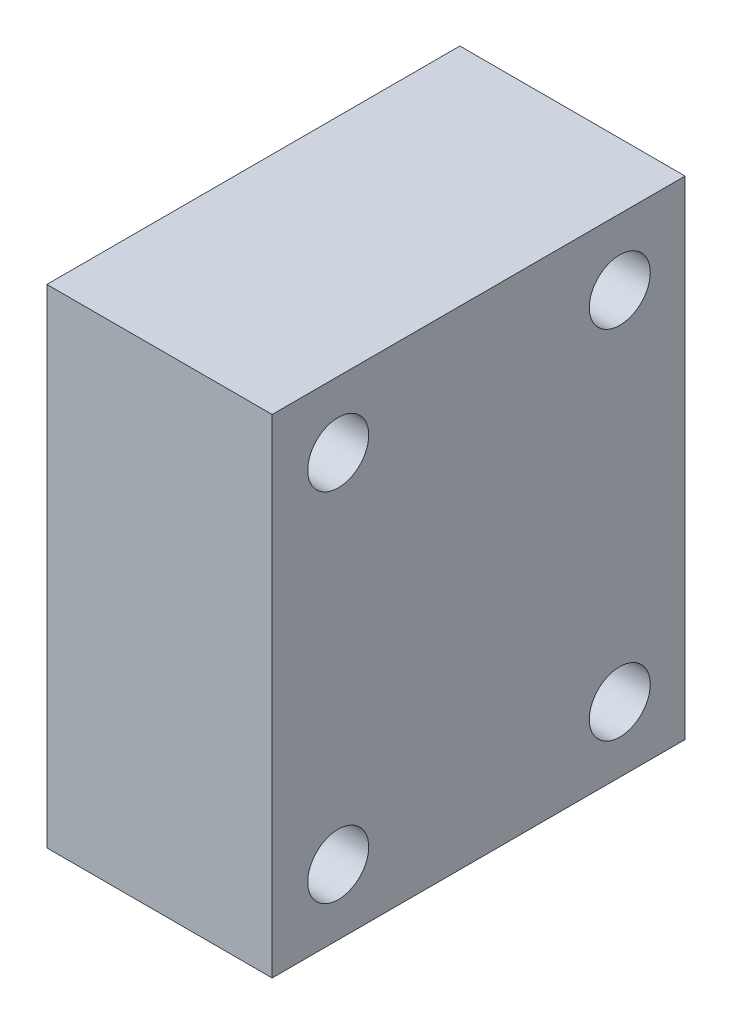
ISO-10303-21;
HEADER;
FILE_DESCRIPTION(('STEP AP214'),'2;1');
FILE_NAME('part.step','',(''),(''),'','','');
FILE_SCHEMA(('AUTOMOTIVE_DESIGN { 1 0 10303 214 1 1 1 1 }'));
ENDSEC;
DATA;
#1=APPLICATION_CONTEXT('core data for automotive mechanical design processes');
#2=APPLICATION_PROTOCOL_DEFINITION('international standard','automotive_design',2000,#1);
#3=PRODUCT_CONTEXT('',#1,'mechanical');
#4=PRODUCT('Part','Part','',(#3));
#5=PRODUCT_RELATED_PRODUCT_CATEGORY('part','',(#4));
#6=PRODUCT_DEFINITION_FORMATION('','',#4);
#7=PRODUCT_DEFINITION_CONTEXT('part definition',#1,'design');
#8=PRODUCT_DEFINITION('design','',#6,#7);
#9=PRODUCT_DEFINITION_SHAPE('','',#8);
#10=(LENGTH_UNIT() NAMED_UNIT(*) SI_UNIT(.MILLI.,.METRE.));
#11=(NAMED_UNIT(*) PLANE_ANGLE_UNIT() SI_UNIT($,.RADIAN.));
#12=(NAMED_UNIT(*) SI_UNIT($,.STERADIAN.) SOLID_ANGLE_UNIT());
#13=UNCERTAINTY_MEASURE_WITH_UNIT(LENGTH_MEASURE(1.E-05),#10,'distance_accuracy_value','');
#14=(GEOMETRIC_REPRESENTATION_CONTEXT(3) GLOBAL_UNCERTAINTY_ASSIGNED_CONTEXT((#13)) GLOBAL_UNIT_ASSIGNED_CONTEXT((#10,
#11,#12)) REPRESENTATION_CONTEXT('',''));
#15=CARTESIAN_POINT('',(0.,0.,0.));
#16=DIRECTION('',(0.,0.,1.));
#17=DIRECTION('',(1.,0.,0.));
#18=AXIS2_PLACEMENT_3D('',#15,#16,#17);
#19=CARTESIAN_POINT('',(38.1,0.,0.));
#20=DIRECTION('',(0.,1.,0.));
#21=DIRECTION('',(0.,0.,1.));
#22=AXIS2_PLACEMENT_3D('',#19,#20,#21);
#23=PLANE('',#22);
#24=DIRECTION('',(0.,0.,-1.));
#25=VECTOR('',#24,1.);
#26=CARTESIAN_POINT('',(0.,0.,0.));
#27=LINE('',#26,#25);
#28=CARTESIAN_POINT('',(0.,0.,69.85));
#29=VERTEX_POINT('',#28);
#30=CARTESIAN_POINT('',(0.,0.,0.));
#31=VERTEX_POINT('',#30);
#32=EDGE_CURVE('E105',#29,#31,#27,.T.);
#33=ORIENTED_EDGE('',*,*,#32,.T.);
#34=DIRECTION('',(-1.,0.,0.));
#35=VECTOR('',#34,1.);
#36=CARTESIAN_POINT('',(38.1,0.,0.));
#37=LINE('',#36,#35);
#38=CARTESIAN_POINT('',(38.1,0.,0.));
#39=VERTEX_POINT('',#38);
#40=EDGE_CURVE('E11',#39,#31,#37,.T.);
#41=ORIENTED_EDGE('',*,*,#40,.F.);
#42=DIRECTION('',(0.,0.,-1.));
#43=VECTOR('',#42,1.);
#44=CARTESIAN_POINT('',(38.1,0.,0.));
#45=LINE('',#44,#43);
#46=CARTESIAN_POINT('',(38.1,0.,69.85));
#47=VERTEX_POINT('',#46);
#48=EDGE_CURVE('E92',#47,#39,#45,.T.);
#49=ORIENTED_EDGE('',*,*,#48,.F.);
#50=DIRECTION('',(-1.,0.,0.));
#51=VECTOR('',#50,1.);
#52=CARTESIAN_POINT('',(38.1,0.,69.85));
#53=LINE('',#52,#51);
#54=EDGE_CURVE('E101',#47,#29,#53,.T.);
#55=ORIENTED_EDGE('',*,*,#54,.T.);
#56=EDGE_LOOP('',(#33,#41,#49,#55));
#57=FACE_BOUND('',#56,.T.);
#58=ADVANCED_FACE('F39',(#57),#23,.F.);
#59=CARTESIAN_POINT('',(38.1,0.,0.));
#60=DIRECTION('',(0.,0.,1.));
#61=DIRECTION('',(1.,0.,0.));
#62=AXIS2_PLACEMENT_3D('',#59,#60,#61);
#63=PLANE('',#62);
#64=DIRECTION('',(0.,1.,0.));
#65=VECTOR('',#64,1.);
#66=CARTESIAN_POINT('',(0.,0.,0.));
#67=LINE('',#66,#65);
#68=CARTESIAN_POINT('',(0.,82.55,0.));
#69=VERTEX_POINT('',#68);
#70=EDGE_CURVE('E96',#31,#69,#67,.T.);
#71=ORIENTED_EDGE('',*,*,#70,.T.);
#72=DIRECTION('',(-1.,0.,0.));
#73=VECTOR('',#72,1.);
#74=CARTESIAN_POINT('',(38.1,82.55,0.));
#75=LINE('',#74,#73);
#76=CARTESIAN_POINT('',(38.1,82.55,0.));
#77=VERTEX_POINT('',#76);
#78=EDGE_CURVE('E48',#77,#69,#75,.T.);
#79=ORIENTED_EDGE('',*,*,#78,.F.);
#80=DIRECTION('',(0.,1.,0.));
#81=VECTOR('',#80,1.);
#82=CARTESIAN_POINT('',(38.1,0.,0.));
#83=LINE('',#82,#81);
#84=EDGE_CURVE('E87',#39,#77,#83,.T.);
#85=ORIENTED_EDGE('',*,*,#84,.F.);
#86=ORIENTED_EDGE('',*,*,#40,.T.);
#87=EDGE_LOOP('',(#71,#79,#85,#86));
#88=FACE_BOUND('',#87,.T.);
#89=ADVANCED_FACE('F95',(#88),#63,.F.);
#90=CARTESIAN_POINT('',(38.1,82.55,0.));
#91=DIRECTION('',(0.,-1.,0.));
#92=DIRECTION('',(0.,0.,-1.));
#93=AXIS2_PLACEMENT_3D('',#90,#91,#92);
#94=PLANE('',#93);
#95=DIRECTION('',(0.,0.,1.));
#96=VECTOR('',#95,1.);
#97=CARTESIAN_POINT('',(0.,82.55,0.));
#98=LINE('',#97,#96);
#99=CARTESIAN_POINT('',(0.,82.55,69.85));
#100=VERTEX_POINT('',#99);
#101=EDGE_CURVE('E74',#69,#100,#98,.T.);
#102=ORIENTED_EDGE('',*,*,#101,.T.);
#103=DIRECTION('',(-1.,0.,0.));
#104=VECTOR('',#103,1.);
#105=CARTESIAN_POINT('',(38.1,82.55,69.85));
#106=LINE('',#105,#104);
#107=CARTESIAN_POINT('',(38.1,82.55,69.85));
#108=VERTEX_POINT('',#107);
#109=EDGE_CURVE('E97',#108,#100,#106,.T.);
#110=ORIENTED_EDGE('',*,*,#109,.F.);
#111=DIRECTION('',(0.,0.,1.));
#112=VECTOR('',#111,1.);
#113=CARTESIAN_POINT('',(38.1,82.55,0.));
#114=LINE('',#113,#112);
#115=EDGE_CURVE('E90',#77,#108,#114,.T.);
#116=ORIENTED_EDGE('',*,*,#115,.F.);
#117=ORIENTED_EDGE('',*,*,#78,.T.);
#118=EDGE_LOOP('',(#102,#110,#116,#117));
#119=FACE_BOUND('',#118,.T.);
#120=ADVANCED_FACE('F99',(#119),#94,.F.);
#121=CARTESIAN_POINT('',(38.1,0.,69.85));
#122=DIRECTION('',(0.,0.,-1.));
#123=DIRECTION('',(-1.,0.,0.));
#124=AXIS2_PLACEMENT_3D('',#121,#122,#123);
#125=PLANE('',#124);
#126=DIRECTION('',(0.,-1.,0.));
#127=VECTOR('',#126,1.);
#128=CARTESIAN_POINT('',(0.,0.,69.85));
#129=LINE('',#128,#127);
#130=EDGE_CURVE('E80',#100,#29,#129,.T.);
#131=ORIENTED_EDGE('',*,*,#130,.T.);
#132=ORIENTED_EDGE('',*,*,#54,.F.);
#133=DIRECTION('',(0.,-1.,0.));
#134=VECTOR('',#133,1.);
#135=CARTESIAN_POINT('',(38.1,0.,69.85));
#136=LINE('',#135,#134);
#137=EDGE_CURVE('E57',#108,#47,#136,.T.);
#138=ORIENTED_EDGE('',*,*,#137,.F.);
#139=ORIENTED_EDGE('',*,*,#109,.T.);
#140=EDGE_LOOP('',(#131,#132,#138,#139));
#141=FACE_BOUND('',#140,.T.);
#142=ADVANCED_FACE('F189',(#141),#125,.F.);
#143=CARTESIAN_POINT('',(38.1,0.,0.));
#144=DIRECTION('',(-1.,0.,0.));
#145=DIRECTION('',(0.,0.,1.));
#146=AXIS2_PLACEMENT_3D('',#143,#144,#145);
#147=PLANE('',#146);
#148=CARTESIAN_POINT('',(38.1,71.374,11.049));
#149=DIRECTION('',(1.,0.,0.));
#150=DIRECTION('',(0.,0.,-1.));
#151=AXIS2_PLACEMENT_3D('',#148,#149,#150);
#152=CIRCLE('',#151,5.15937499999999);
#153=CARTESIAN_POINT('',(38.1,71.374,5.88962500000001));
#154=VERTEX_POINT('',#153);
#155=EDGE_CURVE('E150',#154,#154,#152,.T.);
#156=ORIENTED_EDGE('',*,*,#155,.F.);
#157=EDGE_LOOP('',(#156));
#158=FACE_BOUND('',#157,.T.);
#159=CARTESIAN_POINT('',(38.1,11.049,58.674));
#160=DIRECTION('',(1.,0.,0.));
#161=DIRECTION('',(0.,0.,-1.));
#162=AXIS2_PLACEMENT_3D('',#159,#160,#161);
#163=CIRCLE('',#162,5.159375);
#164=CARTESIAN_POINT('',(38.1,11.049,53.514625));
#165=VERTEX_POINT('',#164);
#166=EDGE_CURVE('E143',#165,#165,#163,.T.);
#167=ORIENTED_EDGE('',*,*,#166,.F.);
#168=EDGE_LOOP('',(#167));
#169=FACE_BOUND('',#168,.T.);
#170=CARTESIAN_POINT('',(38.1,71.374,58.674));
#171=DIRECTION('',(1.,0.,0.));
#172=DIRECTION('',(0.,0.,-1.));
#173=AXIS2_PLACEMENT_3D('',#170,#171,#172);
#174=CIRCLE('',#173,5.15937499999999);
#175=CARTESIAN_POINT('',(38.1,71.374,53.514625));
#176=VERTEX_POINT('',#175);
#177=EDGE_CURVE('E137',#176,#176,#174,.T.);
#178=ORIENTED_EDGE('',*,*,#177,.F.);
#179=EDGE_LOOP('',(#178));
#180=FACE_BOUND('',#179,.T.);
#181=CARTESIAN_POINT('',(38.1,11.049,11.049));
#182=DIRECTION('',(1.,0.,0.));
#183=DIRECTION('',(0.,0.,-1.));
#184=AXIS2_PLACEMENT_3D('',#181,#182,#183);
#185=CIRCLE('',#184,5.159375);
#186=CARTESIAN_POINT('',(38.1,11.049,5.889625));
#187=VERTEX_POINT('',#186);
#188=EDGE_CURVE('E108',#187,#187,#185,.T.);
#189=ORIENTED_EDGE('',*,*,#188,.F.);
#190=EDGE_LOOP('',(#189));
#191=FACE_BOUND('',#190,.T.);
#192=ORIENTED_EDGE('',*,*,#48,.T.);
#193=ORIENTED_EDGE('',*,*,#84,.T.);
#194=ORIENTED_EDGE('',*,*,#115,.T.);
#195=ORIENTED_EDGE('',*,*,#137,.T.);
#196=EDGE_LOOP('',(#192,#193,#194,#195));
#197=FACE_BOUND('',#196,.T.);
#198=ADVANCED_FACE('F88',(#158,#169,#180,#191,#197),#147,.F.);
#199=CARTESIAN_POINT('',(0.,0.,0.));
#200=DIRECTION('',(-1.,0.,0.));
#201=DIRECTION('',(0.,0.,1.));
#202=AXIS2_PLACEMENT_3D('',#199,#200,#201);
#203=PLANE('',#202);
#204=CARTESIAN_POINT('',(0.,23.622,34.798));
#205=DIRECTION('',(1.,0.,0.));
#206=DIRECTION('',(0.,0.,-1.));
#207=AXIS2_PLACEMENT_3D('',#204,#205,#206);
#208=CIRCLE('',#207,12.7254);
#209=CARTESIAN_POINT('',(0.,23.622,22.0726));
#210=VERTEX_POINT('',#209);
#211=EDGE_CURVE('E121',#210,#210,#208,.T.);
#212=ORIENTED_EDGE('',*,*,#211,.T.);
#213=EDGE_LOOP('',(#212));
#214=FACE_BOUND('',#213,.T.);
#215=CARTESIAN_POINT('',(0.,58.674,34.798));
#216=DIRECTION('',(1.,0.,0.));
#217=DIRECTION('',(0.,0.,-1.));
#218=AXIS2_PLACEMENT_3D('',#215,#216,#217);
#219=CIRCLE('',#218,12.7254);
#220=CARTESIAN_POINT('',(0.,58.674,22.0726));
#221=VERTEX_POINT('',#220);
#222=EDGE_CURVE('E126',#221,#221,#219,.T.);
#223=ORIENTED_EDGE('',*,*,#222,.T.);
#224=EDGE_LOOP('',(#223));
#225=FACE_BOUND('',#224,.T.);
#226=CARTESIAN_POINT('',(0.,71.374,11.049));
#227=DIRECTION('',(1.,0.,0.));
#228=DIRECTION('',(0.,0.,-1.));
#229=AXIS2_PLACEMENT_3D('',#226,#227,#228);
#230=CIRCLE('',#229,5.15937499999999);
#231=CARTESIAN_POINT('',(0.,71.374,5.88962500000001));
#232=VERTEX_POINT('',#231);
#233=EDGE_CURVE('E146',#232,#232,#230,.T.);
#234=ORIENTED_EDGE('',*,*,#233,.T.);
#235=EDGE_LOOP('',(#234));
#236=FACE_BOUND('',#235,.T.);
#237=CARTESIAN_POINT('',(0.,11.049,58.674));
#238=DIRECTION('',(1.,0.,0.));
#239=DIRECTION('',(0.,0.,-1.));
#240=AXIS2_PLACEMENT_3D('',#237,#238,#239);
#241=CIRCLE('',#240,5.159375);
#242=CARTESIAN_POINT('',(0.,11.049,53.514625));
#243=VERTEX_POINT('',#242);
#244=EDGE_CURVE('E153',#243,#243,#241,.T.);
#245=ORIENTED_EDGE('',*,*,#244,.T.);
#246=EDGE_LOOP('',(#245));
#247=FACE_BOUND('',#246,.T.);
#248=CARTESIAN_POINT('',(0.,71.374,58.674));
#249=DIRECTION('',(1.,0.,0.));
#250=DIRECTION('',(0.,0.,-1.));
#251=AXIS2_PLACEMENT_3D('',#248,#249,#250);
#252=CIRCLE('',#251,5.15937499999999);
#253=CARTESIAN_POINT('',(0.,71.374,53.514625));
#254=VERTEX_POINT('',#253);
#255=EDGE_CURVE('E140',#254,#254,#252,.T.);
#256=ORIENTED_EDGE('',*,*,#255,.T.);
#257=EDGE_LOOP('',(#256));
#258=FACE_BOUND('',#257,.T.);
#259=CARTESIAN_POINT('',(0.,11.049,11.049));
#260=DIRECTION('',(1.,0.,0.));
#261=DIRECTION('',(0.,0.,-1.));
#262=AXIS2_PLACEMENT_3D('',#259,#260,#261);
#263=CIRCLE('',#262,5.159375);
#264=CARTESIAN_POINT('',(0.,11.049,5.889625));
#265=VERTEX_POINT('',#264);
#266=EDGE_CURVE('E149',#265,#265,#263,.T.);
#267=ORIENTED_EDGE('',*,*,#266,.T.);
#268=EDGE_LOOP('',(#267));
#269=FACE_BOUND('',#268,.T.);
#270=ORIENTED_EDGE('',*,*,#32,.F.);
#271=ORIENTED_EDGE('',*,*,#130,.F.);
#272=ORIENTED_EDGE('',*,*,#101,.F.);
#273=ORIENTED_EDGE('',*,*,#70,.F.);
#274=EDGE_LOOP('',(#270,#271,#272,#273));
#275=FACE_BOUND('',#274,.T.);
#276=ADVANCED_FACE('F163',(#214,#225,#236,#247,#258,#269,#275),#203,.T.);
#277=CARTESIAN_POINT('',(38.1,11.049,11.049));
#278=DIRECTION('',(-1.,0.,0.));
#279=DIRECTION('',(0.,0.,1.));
#280=AXIS2_PLACEMENT_3D('',#277,#278,#279);
#281=CYLINDRICAL_SURFACE('',#280,5.159375);
#282=ORIENTED_EDGE('',*,*,#188,.T.);
#283=EDGE_LOOP('',(#282));
#284=FACE_BOUND('',#283,.T.);
#285=ORIENTED_EDGE('',*,*,#266,.F.);
#286=EDGE_LOOP('',(#285));
#287=FACE_BOUND('',#286,.T.);
#288=ADVANCED_FACE('F166',(#284,#287),#281,.F.);
#289=CARTESIAN_POINT('',(38.1,71.374,58.674));
#290=DIRECTION('',(-1.,0.,0.));
#291=DIRECTION('',(0.,0.,1.));
#292=AXIS2_PLACEMENT_3D('',#289,#290,#291);
#293=CYLINDRICAL_SURFACE('',#292,5.15937499999999);
#294=ORIENTED_EDGE('',*,*,#177,.T.);
#295=EDGE_LOOP('',(#294));
#296=FACE_BOUND('',#295,.T.);
#297=ORIENTED_EDGE('',*,*,#255,.F.);
#298=EDGE_LOOP('',(#297));
#299=FACE_BOUND('',#298,.T.);
#300=ADVANCED_FACE('F168',(#296,#299),#293,.F.);
#301=CARTESIAN_POINT('',(38.1,11.049,58.674));
#302=DIRECTION('',(-1.,0.,0.));
#303=DIRECTION('',(0.,0.,1.));
#304=AXIS2_PLACEMENT_3D('',#301,#302,#303);
#305=CYLINDRICAL_SURFACE('',#304,5.159375);
#306=ORIENTED_EDGE('',*,*,#166,.T.);
#307=EDGE_LOOP('',(#306));
#308=FACE_BOUND('',#307,.T.);
#309=ORIENTED_EDGE('',*,*,#244,.F.);
#310=EDGE_LOOP('',(#309));
#311=FACE_BOUND('',#310,.T.);
#312=ADVANCED_FACE('F175',(#308,#311),#305,.F.);
#313=CARTESIAN_POINT('',(38.1,71.374,11.049));
#314=DIRECTION('',(-1.,0.,0.));
#315=DIRECTION('',(0.,0.,1.));
#316=AXIS2_PLACEMENT_3D('',#313,#314,#315);
#317=CYLINDRICAL_SURFACE('',#316,5.15937499999999);
#318=ORIENTED_EDGE('',*,*,#155,.T.);
#319=EDGE_LOOP('',(#318));
#320=FACE_BOUND('',#319,.T.);
#321=ORIENTED_EDGE('',*,*,#233,.F.);
#322=EDGE_LOOP('',(#321));
#323=FACE_BOUND('',#322,.T.);
#324=ADVANCED_FACE('F241',(#320,#323),#317,.F.);
#325=CARTESIAN_POINT('',(2.8194,23.622,34.798));
#326=DIRECTION('',(-1.,0.,0.));
#327=DIRECTION('',(0.,0.,1.));
#328=AXIS2_PLACEMENT_3D('',#325,#326,#327);
#329=CYLINDRICAL_SURFACE('',#328,12.7254);
#330=CARTESIAN_POINT('',(2.8194,23.622,34.798));
#331=DIRECTION('',(1.,0.,0.));
#332=DIRECTION('',(0.,0.,-1.));
#333=AXIS2_PLACEMENT_3D('',#330,#331,#332);
#334=CIRCLE('',#333,12.7254);
#335=CARTESIAN_POINT('',(2.8194,23.622,22.0726));
#336=VERTEX_POINT('',#335);
#337=EDGE_CURVE('E115',#336,#336,#334,.T.);
#338=ORIENTED_EDGE('',*,*,#337,.T.);
#339=EDGE_LOOP('',(#338));
#340=FACE_BOUND('',#339,.T.);
#341=ORIENTED_EDGE('',*,*,#211,.F.);
#342=EDGE_LOOP('',(#341));
#343=FACE_BOUND('',#342,.T.);
#344=ADVANCED_FACE('F249',(#340,#343),#329,.F.);
#345=CARTESIAN_POINT('',(2.8194,23.622,34.798));
#346=DIRECTION('',(1.,0.,0.));
#347=DIRECTION('',(0.,0.,-1.));
#348=AXIS2_PLACEMENT_3D('',#345,#346,#347);
#349=PLANE('',#348);
#350=CARTESIAN_POINT('',(2.8194,23.622,34.798));
#351=DIRECTION('',(1.,0.,0.));
#352=DIRECTION('',(0.,0.,-1.));
#353=AXIS2_PLACEMENT_3D('',#350,#351,#352);
#354=CIRCLE('',#353,7.3421875);
#355=CARTESIAN_POINT('',(2.8194,23.622,27.4558125));
#356=VERTEX_POINT('',#355);
#357=EDGE_CURVE('E113',#356,#356,#354,.T.);
#358=ORIENTED_EDGE('',*,*,#357,.T.);
#359=EDGE_LOOP('',(#358));
#360=FACE_BOUND('',#359,.T.);
#361=ORIENTED_EDGE('',*,*,#337,.F.);
#362=EDGE_LOOP('',(#361));
#363=FACE_BOUND('',#362,.T.);
#364=ADVANCED_FACE('F295',(#360,#363),#349,.F.);
#365=CARTESIAN_POINT('',(2.8194,58.674,34.798));
#366=DIRECTION('',(-1.,0.,0.));
#367=DIRECTION('',(0.,0.,1.));
#368=AXIS2_PLACEMENT_3D('',#365,#366,#367);
#369=CYLINDRICAL_SURFACE('',#368,12.7254);
#370=CARTESIAN_POINT('',(2.8194,58.674,34.798));
#371=DIRECTION('',(1.,0.,0.));
#372=DIRECTION('',(0.,0.,-1.));
#373=AXIS2_PLACEMENT_3D('',#370,#371,#372);
#374=CIRCLE('',#373,12.7254);
#375=CARTESIAN_POINT('',(2.8194,58.674,22.0726));
#376=VERTEX_POINT('',#375);
#377=EDGE_CURVE('E131',#376,#376,#374,.T.);
#378=ORIENTED_EDGE('',*,*,#377,.T.);
#379=EDGE_LOOP('',(#378));
#380=FACE_BOUND('',#379,.T.);
#381=ORIENTED_EDGE('',*,*,#222,.F.);
#382=EDGE_LOOP('',(#381));
#383=FACE_BOUND('',#382,.T.);
#384=ADVANCED_FACE('F303',(#380,#383),#369,.F.);
#385=CARTESIAN_POINT('',(2.8194,58.674,34.798));
#386=DIRECTION('',(1.,0.,0.));
#387=DIRECTION('',(0.,0.,-1.));
#388=AXIS2_PLACEMENT_3D('',#385,#386,#387);
#389=PLANE('',#388);
#390=CARTESIAN_POINT('',(2.8194,58.674,34.798));
#391=DIRECTION('',(1.,0.,0.));
#392=DIRECTION('',(0.,0.,-1.));
#393=AXIS2_PLACEMENT_3D('',#390,#391,#392);
#394=CIRCLE('',#393,7.3421875);
#395=CARTESIAN_POINT('',(2.8194,58.674,27.4558125));
#396=VERTEX_POINT('',#395);
#397=EDGE_CURVE('E42',#396,#396,#394,.T.);
#398=ORIENTED_EDGE('',*,*,#397,.T.);
#399=EDGE_LOOP('',(#398));
#400=FACE_BOUND('',#399,.T.);
#401=ORIENTED_EDGE('',*,*,#377,.F.);
#402=EDGE_LOOP('',(#401));
#403=FACE_BOUND('',#402,.T.);
#404=ADVANCED_FACE('F286',(#400,#403),#389,.F.);
#405=CARTESIAN_POINT('',(28.448,23.622,34.798));
#406=DIRECTION('',(1.,0.,0.));
#407=DIRECTION('',(0.,0.,-1.));
#408=AXIS2_PLACEMENT_3D('',#405,#406,#407);
#409=PLANE('',#408);
#410=CARTESIAN_POINT('',(28.448,23.622,34.798));
#411=DIRECTION('',(1.,0.,0.));
#412=DIRECTION('',(0.,0.,-1.));
#413=AXIS2_PLACEMENT_3D('',#410,#411,#412);
#414=CIRCLE('',#413,7.3421875);
#415=CARTESIAN_POINT('',(28.448,23.622,27.4558125));
#416=VERTEX_POINT('',#415);
#417=EDGE_CURVE('E134',#416,#416,#414,.T.);
#418=ORIENTED_EDGE('',*,*,#417,.F.);
#419=EDGE_LOOP('',(#418));
#420=FACE_BOUND('',#419,.T.);
#421=ADVANCED_FACE('F277',(#420),#409,.F.);
#422=CARTESIAN_POINT('',(28.448,23.622,34.798));
#423=DIRECTION('',(-1.,0.,0.));
#424=DIRECTION('',(0.,0.,1.));
#425=AXIS2_PLACEMENT_3D('',#422,#423,#424);
#426=CYLINDRICAL_SURFACE('',#425,7.3421875);
#427=ORIENTED_EDGE('',*,*,#357,.F.);
#428=EDGE_LOOP('',(#427));
#429=FACE_BOUND('',#428,.T.);
#430=ORIENTED_EDGE('',*,*,#417,.T.);
#431=EDGE_LOOP('',(#430));
#432=FACE_BOUND('',#431,.T.);
#433=ADVANCED_FACE('F268',(#429,#432),#426,.F.);
#434=CARTESIAN_POINT('',(28.448,58.674,34.798));
#435=DIRECTION('',(1.,0.,0.));
#436=DIRECTION('',(0.,0.,-1.));
#437=AXIS2_PLACEMENT_3D('',#434,#435,#436);
#438=PLANE('',#437);
#439=CARTESIAN_POINT('',(28.448,58.674,34.798));
#440=DIRECTION('',(1.,0.,0.));
#441=DIRECTION('',(0.,0.,-1.));
#442=AXIS2_PLACEMENT_3D('',#439,#440,#441);
#443=CIRCLE('',#442,7.3421875);
#444=CARTESIAN_POINT('',(28.448,58.674,27.4558125));
#445=VERTEX_POINT('',#444);
#446=EDGE_CURVE('E119',#445,#445,#443,.T.);
#447=ORIENTED_EDGE('',*,*,#446,.F.);
#448=EDGE_LOOP('',(#447));
#449=FACE_BOUND('',#448,.T.);
#450=ADVANCED_FACE('F259',(#449),#438,.F.);
#451=CARTESIAN_POINT('',(28.448,58.674,34.798));
#452=DIRECTION('',(-1.,0.,0.));
#453=DIRECTION('',(0.,0.,1.));
#454=AXIS2_PLACEMENT_3D('',#451,#452,#453);
#455=CYLINDRICAL_SURFACE('',#454,7.3421875);
#456=ORIENTED_EDGE('',*,*,#397,.F.);
#457=EDGE_LOOP('',(#456));
#458=FACE_BOUND('',#457,.T.);
#459=ORIENTED_EDGE('',*,*,#446,.T.);
#460=EDGE_LOOP('',(#459));
#461=FACE_BOUND('',#460,.T.);
#462=ADVANCED_FACE('F255',(#458,#461),#455,.F.);
#463=CLOSED_SHELL('',(#58,#89,#120,#142,#198,#276,#288,#300,#312,#324,#344,#364,#384,#404,#421,
#433,#450,#462));
#464=MANIFOLD_SOLID_BREP('B2',#463);
#465=ADVANCED_BREP_SHAPE_REPRESENTATION('',(#18,#464),#14);
#466=SHAPE_DEFINITION_REPRESENTATION(#9,#465);
ENDSEC;
END-ISO-10303-21;
